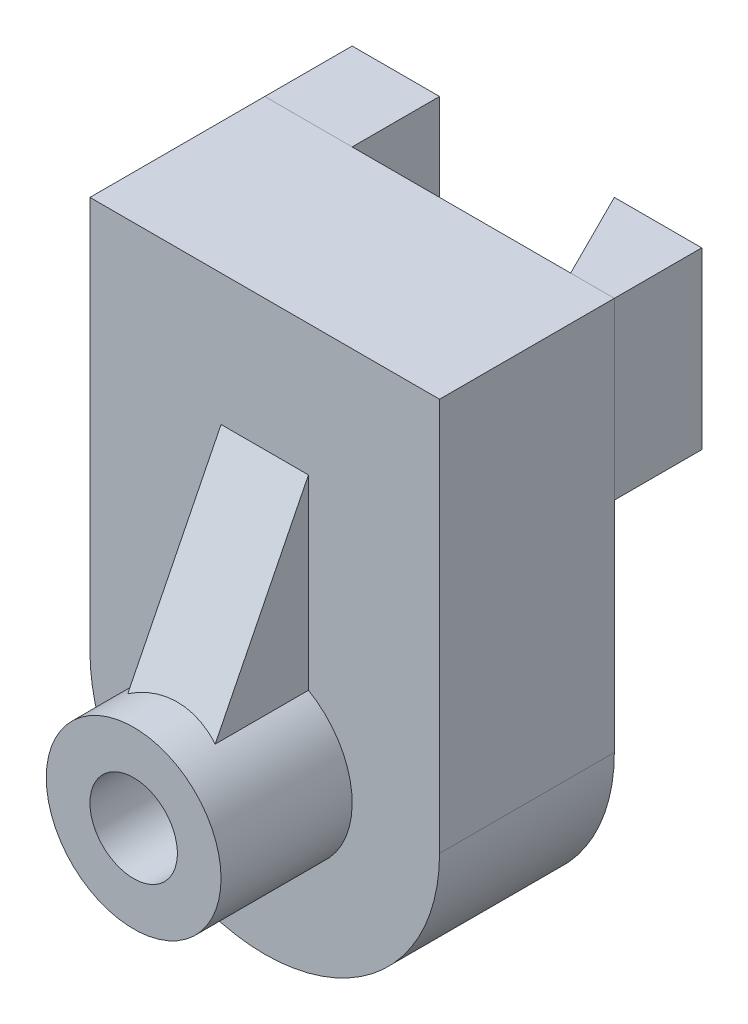
ISO-10303-21;
HEADER;
FILE_DESCRIPTION(('STEP AP214'),'2;1');
FILE_NAME('part.step','',(''),(''),'','','');
FILE_SCHEMA(('AUTOMOTIVE_DESIGN { 1 0 10303 214 1 1 1 1 }'));
ENDSEC;
DATA;
#1=APPLICATION_CONTEXT('core data for automotive mechanical design processes');
#2=APPLICATION_PROTOCOL_DEFINITION('international standard','automotive_design',2000,#1);
#3=PRODUCT_CONTEXT('',#1,'mechanical');
#4=PRODUCT('Part','Part','',(#3));
#5=PRODUCT_RELATED_PRODUCT_CATEGORY('part','',(#4));
#6=PRODUCT_DEFINITION_FORMATION('','',#4);
#7=PRODUCT_DEFINITION_CONTEXT('part definition',#1,'design');
#8=PRODUCT_DEFINITION('design','',#6,#7);
#9=PRODUCT_DEFINITION_SHAPE('','',#8);
#10=(LENGTH_UNIT() NAMED_UNIT(*) SI_UNIT(.MILLI.,.METRE.));
#11=(NAMED_UNIT(*) PLANE_ANGLE_UNIT() SI_UNIT($,.RADIAN.));
#12=(NAMED_UNIT(*) SI_UNIT($,.STERADIAN.) SOLID_ANGLE_UNIT());
#13=UNCERTAINTY_MEASURE_WITH_UNIT(LENGTH_MEASURE(1.E-05),#10,'distance_accuracy_value','');
#14=(GEOMETRIC_REPRESENTATION_CONTEXT(3) GLOBAL_UNCERTAINTY_ASSIGNED_CONTEXT((#13)) GLOBAL_UNIT_ASSIGNED_CONTEXT((#10,
#11,#12)) REPRESENTATION_CONTEXT('',''));
#15=CARTESIAN_POINT('',(0.,0.,0.));
#16=DIRECTION('',(0.,0.,1.));
#17=DIRECTION('',(1.,0.,0.));
#18=AXIS2_PLACEMENT_3D('',#15,#16,#17);
#19=CARTESIAN_POINT('',(-10.,-20.,0.));
#20=DIRECTION('',(-1.,0.,0.));
#21=DIRECTION('',(0.,0.,1.));
#22=AXIS2_PLACEMENT_3D('',#19,#20,#21);
#23=PLANE('',#22);
#24=DIRECTION('',(0.,0.,1.));
#25=VECTOR('',#24,1.);
#26=CARTESIAN_POINT('',(-10.,0.,0.));
#27=LINE('',#26,#25);
#28=CARTESIAN_POINT('',(-10.,0.,-10.));
#29=VERTEX_POINT('',#28);
#30=CARTESIAN_POINT('',(-10.,0.,0.));
#31=VERTEX_POINT('',#30);
#32=EDGE_CURVE('E117',#29,#31,#27,.T.);
#33=ORIENTED_EDGE('',*,*,#32,.T.);
#34=DIRECTION('',(0.,1.,0.));
#35=VECTOR('',#34,1.);
#36=CARTESIAN_POINT('',(-10.,-20.,0.));
#37=LINE('',#36,#35);
#38=CARTESIAN_POINT('',(-10.,-20.,0.));
#39=VERTEX_POINT('',#38);
#40=EDGE_CURVE('E12',#39,#31,#37,.T.);
#41=ORIENTED_EDGE('',*,*,#40,.F.);
#42=DIRECTION('',(0.,0.,1.));
#43=VECTOR('',#42,1.);
#44=CARTESIAN_POINT('',(-10.,-20.,0.));
#45=LINE('',#44,#43);
#46=CARTESIAN_POINT('',(-10.,-20.,-10.));
#47=VERTEX_POINT('',#46);
#48=EDGE_CURVE('E72',#47,#39,#45,.T.);
#49=ORIENTED_EDGE('',*,*,#48,.F.);
#50=DIRECTION('',(0.,1.,0.));
#51=VECTOR('',#50,1.);
#52=CARTESIAN_POINT('',(-10.,-20.,-10.));
#53=LINE('',#52,#51);
#54=EDGE_CURVE('E57',#47,#29,#53,.T.);
#55=ORIENTED_EDGE('',*,*,#54,.T.);
#56=EDGE_LOOP('',(#33,#41,#49,#55));
#57=FACE_BOUND('',#56,.T.);
#58=ADVANCED_FACE('F54',(#57),#23,.F.);
#59=CARTESIAN_POINT('',(0.,-20.,0.));
#60=DIRECTION('',(0.,0.,1.));
#61=DIRECTION('',(1.,0.,0.));
#62=AXIS2_PLACEMENT_3D('',#59,#60,#61);
#63=PLANE('',#62);
#64=DIRECTION('',(1.,0.,0.));
#65=VECTOR('',#64,1.);
#66=CARTESIAN_POINT('',(0.,0.,0.));
#67=LINE('',#66,#65);
#68=CARTESIAN_POINT('',(-20.,0.,0.));
#69=VERTEX_POINT('',#68);
#70=EDGE_CURVE('E113',#69,#31,#67,.T.);
#71=ORIENTED_EDGE('',*,*,#70,.F.);
#72=DIRECTION('',(0.,1.,0.));
#73=VECTOR('',#72,1.);
#74=CARTESIAN_POINT('',(-20.,-20.,0.));
#75=LINE('',#74,#73);
#76=CARTESIAN_POINT('',(-20.,-20.,0.));
#77=VERTEX_POINT('',#76);
#78=EDGE_CURVE('E63',#77,#69,#75,.T.);
#79=ORIENTED_EDGE('',*,*,#78,.F.);
#80=DIRECTION('',(1.,0.,0.));
#81=VECTOR('',#80,1.);
#82=CARTESIAN_POINT('',(0.,-20.,0.));
#83=LINE('',#82,#81);
#84=EDGE_CURVE('E102',#77,#39,#83,.T.);
#85=ORIENTED_EDGE('',*,*,#84,.T.);
#86=ORIENTED_EDGE('',*,*,#40,.T.);
#87=EDGE_LOOP('',(#71,#79,#85,#86));
#88=FACE_BOUND('',#87,.T.);
#89=ADVANCED_FACE('F127',(#88),#63,.T.);
#90=CARTESIAN_POINT('',(-20.,-20.,0.));
#91=DIRECTION('',(1.,0.,0.));
#92=DIRECTION('',(0.,0.,-1.));
#93=AXIS2_PLACEMENT_3D('',#90,#91,#92);
#94=PLANE('',#93);
#95=DIRECTION('',(0.,0.,-1.));
#96=VECTOR('',#95,1.);
#97=CARTESIAN_POINT('',(-20.,0.,0.));
#98=LINE('',#97,#96);
#99=CARTESIAN_POINT('',(-20.,0.,-10.));
#100=VERTEX_POINT('',#99);
#101=EDGE_CURVE('E107',#69,#100,#98,.T.);
#102=ORIENTED_EDGE('',*,*,#101,.T.);
#103=DIRECTION('',(0.,1.,0.));
#104=VECTOR('',#103,1.);
#105=CARTESIAN_POINT('',(-20.,-20.,-10.));
#106=LINE('',#105,#104);
#107=CARTESIAN_POINT('',(-20.,-20.,-10.));
#108=VERTEX_POINT('',#107);
#109=EDGE_CURVE('E105',#108,#100,#106,.T.);
#110=ORIENTED_EDGE('',*,*,#109,.F.);
#111=DIRECTION('',(0.,0.,-1.));
#112=VECTOR('',#111,1.);
#113=CARTESIAN_POINT('',(-20.,-20.,0.));
#114=LINE('',#113,#112);
#115=EDGE_CURVE('E99',#77,#108,#114,.T.);
#116=ORIENTED_EDGE('',*,*,#115,.F.);
#117=ORIENTED_EDGE('',*,*,#78,.T.);
#118=EDGE_LOOP('',(#102,#110,#116,#117));
#119=FACE_BOUND('',#118,.T.);
#120=ADVANCED_FACE('F106',(#119),#94,.F.);
#121=CARTESIAN_POINT('',(0.,-20.,-10.));
#122=DIRECTION('',(0.,0.,1.));
#123=DIRECTION('',(1.,0.,0.));
#124=AXIS2_PLACEMENT_3D('',#121,#122,#123);
#125=PLANE('',#124);
#126=DIRECTION('',(1.,0.,0.));
#127=VECTOR('',#126,1.);
#128=CARTESIAN_POINT('',(0.,0.,-10.));
#129=LINE('',#128,#127);
#130=EDGE_CURVE('E119',#100,#29,#129,.T.);
#131=ORIENTED_EDGE('',*,*,#130,.T.);
#132=ORIENTED_EDGE('',*,*,#54,.F.);
#133=DIRECTION('',(1.,0.,0.));
#134=VECTOR('',#133,1.);
#135=CARTESIAN_POINT('',(0.,-20.,-10.));
#136=LINE('',#135,#134);
#137=EDGE_CURVE('E97',#108,#47,#136,.T.);
#138=ORIENTED_EDGE('',*,*,#137,.F.);
#139=ORIENTED_EDGE('',*,*,#109,.T.);
#140=EDGE_LOOP('',(#131,#132,#138,#139));
#141=FACE_BOUND('',#140,.T.);
#142=ADVANCED_FACE('F110',(#141),#125,.F.);
#143=CARTESIAN_POINT('',(0.,-20.,0.));
#144=DIRECTION('',(0.,1.,0.));
#145=DIRECTION('',(0.,0.,1.));
#146=AXIS2_PLACEMENT_3D('',#143,#144,#145);
#147=PLANE('',#146);
#148=ORIENTED_EDGE('',*,*,#48,.T.);
#149=ORIENTED_EDGE('',*,*,#84,.F.);
#150=ORIENTED_EDGE('',*,*,#115,.T.);
#151=ORIENTED_EDGE('',*,*,#137,.T.);
#152=EDGE_LOOP('',(#148,#149,#150,#151));
#153=FACE_BOUND('',#152,.T.);
#154=ADVANCED_FACE('F101',(#153),#147,.F.);
#155=CARTESIAN_POINT('',(0.,0.,0.));
#156=DIRECTION('',(0.,1.,0.));
#157=DIRECTION('',(0.,0.,1.));
#158=AXIS2_PLACEMENT_3D('',#155,#156,#157);
#159=PLANE('',#158);
#160=ORIENTED_EDGE('',*,*,#32,.F.);
#161=ORIENTED_EDGE('',*,*,#130,.F.);
#162=ORIENTED_EDGE('',*,*,#101,.F.);
#163=ORIENTED_EDGE('',*,*,#70,.T.);
#164=EDGE_LOOP('',(#160,#161,#162,#163));
#165=FACE_BOUND('',#164,.T.);
#166=ADVANCED_FACE('F126',(#165),#159,.T.);
#167=CLOSED_SHELL('',(#58,#89,#120,#142,#154,#166));
#168=MANIFOLD_SOLID_BREP('B2',#167);
#169=CARTESIAN_POINT('',(0.,-20.,-10.));
#170=DIRECTION('',(0.,0.,-1.));
#171=DIRECTION('',(-1.,0.,0.));
#172=AXIS2_PLACEMENT_3D('',#169,#170,#171);
#173=PLANE('',#172);
#174=DIRECTION('',(-1.,0.,0.));
#175=VECTOR('',#174,1.);
#176=CARTESIAN_POINT('',(0.,0.,-10.));
#177=LINE('',#176,#175);
#178=CARTESIAN_POINT('',(20.,0.,-10.));
#179=VERTEX_POINT('',#178);
#180=CARTESIAN_POINT('',(10.,0.,-10.));
#181=VERTEX_POINT('',#180);
#182=EDGE_CURVE('E251',#179,#181,#177,.T.);
#183=ORIENTED_EDGE('',*,*,#182,.F.);
#184=DIRECTION('',(0.,1.,0.));
#185=VECTOR('',#184,1.);
#186=CARTESIAN_POINT('',(20.,-20.,-10.));
#187=LINE('',#186,#185);
#188=CARTESIAN_POINT('',(20.,-20.,-10.));
#189=VERTEX_POINT('',#188);
#190=EDGE_CURVE('E52',#189,#179,#187,.T.);
#191=ORIENTED_EDGE('',*,*,#190,.F.);
#192=DIRECTION('',(-1.,0.,0.));
#193=VECTOR('',#192,1.);
#194=CARTESIAN_POINT('',(0.,-20.,-10.));
#195=LINE('',#194,#193);
#196=CARTESIAN_POINT('',(10.,-20.,-10.));
#197=VERTEX_POINT('',#196);
#198=EDGE_CURVE('E245',#189,#197,#195,.T.);
#199=ORIENTED_EDGE('',*,*,#198,.T.);
#200=DIRECTION('',(0.,1.,0.));
#201=VECTOR('',#200,1.);
#202=CARTESIAN_POINT('',(10.,-20.,-10.));
#203=LINE('',#202,#201);
#204=EDGE_CURVE('E190',#197,#181,#203,.T.);
#205=ORIENTED_EDGE('',*,*,#204,.T.);
#206=EDGE_LOOP('',(#183,#191,#199,#205));
#207=FACE_BOUND('',#206,.T.);
#208=ADVANCED_FACE('F187',(#207),#173,.T.);
#209=CARTESIAN_POINT('',(20.,-20.,0.));
#210=DIRECTION('',(1.,0.,0.));
#211=DIRECTION('',(0.,0.,-1.));
#212=AXIS2_PLACEMENT_3D('',#209,#210,#211);
#213=PLANE('',#212);
#214=DIRECTION('',(0.,0.,-1.));
#215=VECTOR('',#214,1.);
#216=CARTESIAN_POINT('',(20.,0.,0.));
#217=LINE('',#216,#215);
#218=CARTESIAN_POINT('',(20.,0.,0.));
#219=VERTEX_POINT('',#218);
#220=EDGE_CURVE('E247',#219,#179,#217,.T.);
#221=ORIENTED_EDGE('',*,*,#220,.F.);
#222=DIRECTION('',(0.,1.,0.));
#223=VECTOR('',#222,1.);
#224=CARTESIAN_POINT('',(20.,-20.,0.));
#225=LINE('',#224,#223);
#226=CARTESIAN_POINT('',(20.,-20.,0.));
#227=VERTEX_POINT('',#226);
#228=EDGE_CURVE('E196',#227,#219,#225,.T.);
#229=ORIENTED_EDGE('',*,*,#228,.F.);
#230=DIRECTION('',(0.,0.,-1.));
#231=VECTOR('',#230,1.);
#232=CARTESIAN_POINT('',(20.,-20.,0.));
#233=LINE('',#232,#231);
#234=EDGE_CURVE('E242',#227,#189,#233,.T.);
#235=ORIENTED_EDGE('',*,*,#234,.T.);
#236=ORIENTED_EDGE('',*,*,#190,.T.);
#237=EDGE_LOOP('',(#221,#229,#235,#236));
#238=FACE_BOUND('',#237,.T.);
#239=ADVANCED_FACE('F261',(#238),#213,.T.);
#240=CARTESIAN_POINT('',(0.,-20.,0.));
#241=DIRECTION('',(0.,0.,1.));
#242=DIRECTION('',(1.,0.,0.));
#243=AXIS2_PLACEMENT_3D('',#240,#241,#242);
#244=PLANE('',#243);
#245=DIRECTION('',(1.,0.,0.));
#246=VECTOR('',#245,1.);
#247=CARTESIAN_POINT('',(0.,0.,0.));
#248=LINE('',#247,#246);
#249=CARTESIAN_POINT('',(15.,0.,0.));
#250=VERTEX_POINT('',#249);
#251=EDGE_CURVE('E237',#250,#219,#248,.T.);
#252=ORIENTED_EDGE('',*,*,#251,.F.);
#253=DIRECTION('',(0.,1.,0.));
#254=VECTOR('',#253,1.);
#255=CARTESIAN_POINT('',(15.,-20.,0.));
#256=LINE('',#255,#254);
#257=CARTESIAN_POINT('',(15.,-20.,0.));
#258=VERTEX_POINT('',#257);
#259=EDGE_CURVE('E232',#258,#250,#256,.T.);
#260=ORIENTED_EDGE('',*,*,#259,.F.);
#261=DIRECTION('',(1.,0.,0.));
#262=VECTOR('',#261,1.);
#263=CARTESIAN_POINT('',(0.,-20.,0.));
#264=LINE('',#263,#262);
#265=EDGE_CURVE('E235',#258,#227,#264,.T.);
#266=ORIENTED_EDGE('',*,*,#265,.T.);
#267=ORIENTED_EDGE('',*,*,#228,.T.);
#268=EDGE_LOOP('',(#252,#260,#266,#267));
#269=FACE_BOUND('',#268,.T.);
#270=ADVANCED_FACE('F234',(#269),#244,.T.);
#271=CARTESIAN_POINT('',(12.,-20.,-6.));
#272=DIRECTION('',(-0.894427190999916,0.,0.447213595499958));
#273=DIRECTION('',(0.447213595499958,0.,0.894427190999916));
#274=AXIS2_PLACEMENT_3D('',#271,#272,#273);
#275=PLANE('',#274);
#276=DIRECTION('',(0.447213595499958,0.,0.894427190999916));
#277=VECTOR('',#276,1.);
#278=CARTESIAN_POINT('',(12.,0.,-6.));
#279=LINE('',#278,#277);
#280=EDGE_CURVE('E254',#181,#250,#279,.T.);
#281=ORIENTED_EDGE('',*,*,#280,.F.);
#282=ORIENTED_EDGE('',*,*,#204,.F.);
#283=DIRECTION('',(0.447213595499958,0.,0.894427190999916));
#284=VECTOR('',#283,1.);
#285=CARTESIAN_POINT('',(12.,-20.,-6.));
#286=LINE('',#285,#284);
#287=EDGE_CURVE('E241',#197,#258,#286,.T.);
#288=ORIENTED_EDGE('',*,*,#287,.T.);
#289=ORIENTED_EDGE('',*,*,#259,.T.);
#290=EDGE_LOOP('',(#281,#282,#288,#289));
#291=FACE_BOUND('',#290,.T.);
#292=ADVANCED_FACE('F244',(#291),#275,.T.);
#293=CARTESIAN_POINT('',(0.,-20.,0.));
#294=DIRECTION('',(0.,1.,0.));
#295=DIRECTION('',(0.,0.,1.));
#296=AXIS2_PLACEMENT_3D('',#293,#294,#295);
#297=PLANE('',#296);
#298=ORIENTED_EDGE('',*,*,#198,.F.);
#299=ORIENTED_EDGE('',*,*,#234,.F.);
#300=ORIENTED_EDGE('',*,*,#265,.F.);
#301=ORIENTED_EDGE('',*,*,#287,.F.);
#302=EDGE_LOOP('',(#298,#299,#300,#301));
#303=FACE_BOUND('',#302,.T.);
#304=ADVANCED_FACE('F240',(#303),#297,.F.);
#305=CARTESIAN_POINT('',(0.,0.,0.));
#306=DIRECTION('',(0.,1.,0.));
#307=DIRECTION('',(0.,0.,1.));
#308=AXIS2_PLACEMENT_3D('',#305,#306,#307);
#309=PLANE('',#308);
#310=ORIENTED_EDGE('',*,*,#182,.T.);
#311=ORIENTED_EDGE('',*,*,#280,.T.);
#312=ORIENTED_EDGE('',*,*,#251,.T.);
#313=ORIENTED_EDGE('',*,*,#220,.T.);
#314=EDGE_LOOP('',(#310,#311,#312,#313));
#315=FACE_BOUND('',#314,.T.);
#316=ADVANCED_FACE('F260',(#315),#309,.T.);
#317=CLOSED_SHELL('',(#208,#239,#270,#292,#304,#316));
#318=MANIFOLD_SOLID_BREP('B6',#317);
#319=CARTESIAN_POINT('',(0.,-65.,20.));
#320=DIRECTION('',(0.,0.,-1.));
#321=DIRECTION('',(-1.,0.,0.));
#322=AXIS2_PLACEMENT_3D('',#319,#320,#321);
#323=PLANE('',#322);
#324=CARTESIAN_POINT('',(0.,-45.,20.));
#325=DIRECTION('',(0.,0.,-1.));
#326=DIRECTION('',(-1.,0.,0.));
#327=AXIS2_PLACEMENT_3D('',#324,#325,#326);
#328=CIRCLE('',#327,20.);
#329=CARTESIAN_POINT('',(0.,-65.,20.));
#330=VERTEX_POINT('',#329);
#331=CARTESIAN_POINT('',(20.,-45.,20.));
#332=VERTEX_POINT('',#331);
#333=EDGE_CURVE('E436',#330,#332,#328,.F.);
#334=ORIENTED_EDGE('',*,*,#333,.T.);
#335=DIRECTION('',(0.,1.,0.));
#336=VECTOR('',#335,1.);
#337=CARTESIAN_POINT('',(20.,-65.,20.));
#338=LINE('',#337,#336);
#339=CARTESIAN_POINT('',(20.,0.,20.));
#340=VERTEX_POINT('',#339);
#341=EDGE_CURVE('E420',#332,#340,#338,.T.);
#342=ORIENTED_EDGE('',*,*,#341,.T.);
#343=DIRECTION('',(-1.,0.,0.));
#344=VECTOR('',#343,1.);
#345=CARTESIAN_POINT('',(0.,0.,20.));
#346=LINE('',#345,#344);
#347=CARTESIAN_POINT('',(-20.,0.,20.));
#348=VERTEX_POINT('',#347);
#349=EDGE_CURVE('E409',#340,#348,#346,.T.);
#350=ORIENTED_EDGE('',*,*,#349,.T.);
#351=DIRECTION('',(0.,1.,0.));
#352=VECTOR('',#351,1.);
#353=CARTESIAN_POINT('',(-20.,-65.,20.));
#354=LINE('',#353,#352);
#355=CARTESIAN_POINT('',(-20.,-45.,20.));
#356=VERTEX_POINT('',#355);
#357=EDGE_CURVE('E421',#356,#348,#354,.T.);
#358=ORIENTED_EDGE('',*,*,#357,.F.);
#359=CARTESIAN_POINT('',(0.,-45.,20.));
#360=DIRECTION('',(0.,0.,-1.));
#361=DIRECTION('',(-1.,0.,0.));
#362=AXIS2_PLACEMENT_3D('',#359,#360,#361);
#363=CIRCLE('',#362,20.);
#364=EDGE_CURVE('E438',#356,#330,#363,.F.);
#365=ORIENTED_EDGE('',*,*,#364,.T.);
#366=EDGE_LOOP('',(#334,#342,#350,#358,#365));
#367=FACE_BOUND('',#366,.T.);
#368=DIRECTION('',(0.,-1.,0.));
#369=VECTOR('',#368,1.);
#370=CARTESIAN_POINT('',(5.,-65.,20.));
#371=LINE('',#370,#369);
#372=CARTESIAN_POINT('',(5.,-15.,20.));
#373=VERTEX_POINT('',#372);
#374=CARTESIAN_POINT('',(5.,-36.3397459621556,20.));
#375=VERTEX_POINT('',#374);
#376=EDGE_CURVE('E385',#373,#375,#371,.T.);
#377=ORIENTED_EDGE('',*,*,#376,.T.);
#378=CARTESIAN_POINT('',(0.,-45.,20.));
#379=DIRECTION('',(0.,0.,-1.));
#380=DIRECTION('',(-1.,0.,0.));
#381=AXIS2_PLACEMENT_3D('',#378,#379,#380);
#382=CIRCLE('',#381,10.);
#383=CARTESIAN_POINT('',(-5.,-36.3397459621556,20.));
#384=VERTEX_POINT('',#383);
#385=EDGE_CURVE('E185',#384,#375,#382,.F.);
#386=ORIENTED_EDGE('',*,*,#385,.F.);
#387=DIRECTION('',(0.,-1.,0.));
#388=VECTOR('',#387,1.);
#389=CARTESIAN_POINT('',(-5.,-65.,20.));
#390=LINE('',#389,#388);
#391=CARTESIAN_POINT('',(-5.,-15.,20.));
#392=VERTEX_POINT('',#391);
#393=EDGE_CURVE('E331',#392,#384,#390,.T.);
#394=ORIENTED_EDGE('',*,*,#393,.F.);
#395=DIRECTION('',(-1.,0.,0.));
#396=VECTOR('',#395,1.);
#397=CARTESIAN_POINT('',(0.,-15.,20.));
#398=LINE('',#397,#396);
#399=EDGE_CURVE('E326',#392,#373,#398,.F.);
#400=ORIENTED_EDGE('',*,*,#399,.T.);
#401=EDGE_LOOP('',(#377,#386,#394,#400));
#402=FACE_BOUND('',#401,.T.);
#403=ADVANCED_FACE('F311',(#367,#402),#323,.F.);
#404=CARTESIAN_POINT('',(-20.,-65.,0.));
#405=DIRECTION('',(1.,0.,0.));
#406=DIRECTION('',(0.,0.,-1.));
#407=AXIS2_PLACEMENT_3D('',#404,#405,#406);
#408=PLANE('',#407);
#409=DIRECTION('',(0.,1.,0.));
#410=VECTOR('',#409,1.);
#411=CARTESIAN_POINT('',(-20.,-65.,0.));
#412=LINE('',#411,#410);
#413=CARTESIAN_POINT('',(-20.,-45.,0.));
#414=VERTEX_POINT('',#413);
#415=CARTESIAN_POINT('',(-20.,0.,0.));
#416=VERTEX_POINT('',#415);
#417=EDGE_CURVE('E424',#414,#416,#412,.T.);
#418=ORIENTED_EDGE('',*,*,#417,.F.);
#419=DIRECTION('',(0.,0.,-1.));
#420=VECTOR('',#419,1.);
#421=CARTESIAN_POINT('',(-20.,-45.,0.));
#422=LINE('',#421,#420);
#423=EDGE_CURVE('E433',#414,#356,#422,.F.);
#424=ORIENTED_EDGE('',*,*,#423,.T.);
#425=ORIENTED_EDGE('',*,*,#357,.T.);
#426=DIRECTION('',(0.,0.,-1.));
#427=VECTOR('',#426,1.);
#428=CARTESIAN_POINT('',(-20.,0.,0.));
#429=LINE('',#428,#427);
#430=EDGE_CURVE('E417',#348,#416,#429,.T.);
#431=ORIENTED_EDGE('',*,*,#430,.T.);
#432=EDGE_LOOP('',(#418,#424,#425,#431));
#433=FACE_BOUND('',#432,.T.);
#434=ADVANCED_FACE('F464',(#433),#408,.F.);
#435=CARTESIAN_POINT('',(0.,-65.,0.));
#436=DIRECTION('',(0.,0.,1.));
#437=DIRECTION('',(1.,0.,0.));
#438=AXIS2_PLACEMENT_3D('',#435,#436,#437);
#439=PLANE('',#438);
#440=CARTESIAN_POINT('',(0.,-45.,0.));
#441=DIRECTION('',(0.,0.,-1.));
#442=DIRECTION('',(-1.,0.,0.));
#443=AXIS2_PLACEMENT_3D('',#440,#441,#442);
#444=CIRCLE('',#443,10.);
#445=CARTESIAN_POINT('',(-10.,-45.,0.));
#446=VERTEX_POINT('',#445);
#447=EDGE_CURVE('E519',#446,#446,#444,.T.);
#448=ORIENTED_EDGE('',*,*,#447,.F.);
#449=EDGE_LOOP('',(#448));
#450=FACE_BOUND('',#449,.T.);
#451=CARTESIAN_POINT('',(0.,-45.,0.));
#452=DIRECTION('',(0.,0.,1.));
#453=DIRECTION('',(1.,0.,0.));
#454=AXIS2_PLACEMENT_3D('',#451,#452,#453);
#455=CIRCLE('',#454,20.);
#456=CARTESIAN_POINT('',(20.,-45.,0.));
#457=VERTEX_POINT('',#456);
#458=CARTESIAN_POINT('',(0.,-65.,0.));
#459=VERTEX_POINT('',#458);
#460=EDGE_CURVE('E423',#457,#459,#455,.F.);
#461=ORIENTED_EDGE('',*,*,#460,.T.);
#462=CARTESIAN_POINT('',(0.,-45.,0.));
#463=DIRECTION('',(0.,0.,1.));
#464=DIRECTION('',(1.,0.,0.));
#465=AXIS2_PLACEMENT_3D('',#462,#463,#464);
#466=CIRCLE('',#465,20.);
#467=EDGE_CURVE('E431',#459,#414,#466,.F.);
#468=ORIENTED_EDGE('',*,*,#467,.T.);
#469=ORIENTED_EDGE('',*,*,#417,.T.);
#470=DIRECTION('',(1.,0.,0.));
#471=VECTOR('',#470,1.);
#472=CARTESIAN_POINT('',(0.,0.,0.));
#473=LINE('',#472,#471);
#474=CARTESIAN_POINT('',(20.,0.,0.));
#475=VERTEX_POINT('',#474);
#476=EDGE_CURVE('E415',#416,#475,#473,.T.);
#477=ORIENTED_EDGE('',*,*,#476,.T.);
#478=DIRECTION('',(0.,1.,0.));
#479=VECTOR('',#478,1.);
#480=CARTESIAN_POINT('',(20.,-65.,0.));
#481=LINE('',#480,#479);
#482=EDGE_CURVE('E426',#457,#475,#481,.T.);
#483=ORIENTED_EDGE('',*,*,#482,.F.);
#484=EDGE_LOOP('',(#461,#468,#469,#477,#483));
#485=FACE_BOUND('',#484,.T.);
#486=ADVANCED_FACE('F466',(#450,#485),#439,.F.);
#487=CARTESIAN_POINT('',(20.,-65.,0.));
#488=DIRECTION('',(-1.,0.,0.));
#489=DIRECTION('',(0.,0.,1.));
#490=AXIS2_PLACEMENT_3D('',#487,#488,#489);
#491=PLANE('',#490);
#492=ORIENTED_EDGE('',*,*,#341,.F.);
#493=DIRECTION('',(0.,0.,1.));
#494=VECTOR('',#493,1.);
#495=CARTESIAN_POINT('',(20.,-45.,0.));
#496=LINE('',#495,#494);
#497=EDGE_CURVE('E319',#332,#457,#496,.F.);
#498=ORIENTED_EDGE('',*,*,#497,.T.);
#499=ORIENTED_EDGE('',*,*,#482,.T.);
#500=DIRECTION('',(0.,0.,1.));
#501=VECTOR('',#500,1.);
#502=CARTESIAN_POINT('',(20.,0.,0.));
#503=LINE('',#502,#501);
#504=EDGE_CURVE('E412',#475,#340,#503,.T.);
#505=ORIENTED_EDGE('',*,*,#504,.T.);
#506=EDGE_LOOP('',(#492,#498,#499,#505));
#507=FACE_BOUND('',#506,.T.);
#508=ADVANCED_FACE('F454',(#507),#491,.F.);
#509=CARTESIAN_POINT('',(0.,0.,0.));
#510=DIRECTION('',(0.,1.,0.));
#511=DIRECTION('',(0.,0.,1.));
#512=AXIS2_PLACEMENT_3D('',#509,#510,#511);
#513=PLANE('',#512);
#514=ORIENTED_EDGE('',*,*,#504,.F.);
#515=ORIENTED_EDGE('',*,*,#476,.F.);
#516=ORIENTED_EDGE('',*,*,#430,.F.);
#517=ORIENTED_EDGE('',*,*,#349,.F.);
#518=EDGE_LOOP('',(#514,#515,#516,#517));
#519=FACE_BOUND('',#518,.T.);
#520=ADVANCED_FACE('F461',(#519),#513,.T.);
#521=CARTESIAN_POINT('',(0.,-45.,0.));
#522=DIRECTION('',(0.,0.,1.));
#523=DIRECTION('',(1.,0.,0.));
#524=AXIS2_PLACEMENT_3D('',#521,#522,#523);
#525=CYLINDRICAL_SURFACE('',#524,20.);
#526=ORIENTED_EDGE('',*,*,#497,.F.);
#527=ORIENTED_EDGE('',*,*,#333,.F.);
#528=DIRECTION('',(0.,0.,1.));
#529=VECTOR('',#528,1.);
#530=CARTESIAN_POINT('',(0.,-65.,0.));
#531=LINE('',#530,#529);
#532=EDGE_CURVE('E408',#459,#330,#531,.T.);
#533=ORIENTED_EDGE('',*,*,#532,.F.);
#534=ORIENTED_EDGE('',*,*,#460,.F.);
#535=EDGE_LOOP('',(#526,#527,#533,#534));
#536=FACE_BOUND('',#535,.T.);
#537=ADVANCED_FACE('F313',(#536),#525,.T.);
#538=CARTESIAN_POINT('',(0.,-45.,0.));
#539=DIRECTION('',(0.,0.,-1.));
#540=DIRECTION('',(-1.,0.,0.));
#541=AXIS2_PLACEMENT_3D('',#538,#539,#540);
#542=CYLINDRICAL_SURFACE('',#541,20.);
#543=ORIENTED_EDGE('',*,*,#532,.T.);
#544=ORIENTED_EDGE('',*,*,#364,.F.);
#545=ORIENTED_EDGE('',*,*,#423,.F.);
#546=ORIENTED_EDGE('',*,*,#467,.F.);
#547=EDGE_LOOP('',(#543,#544,#545,#546));
#548=FACE_BOUND('',#547,.T.);
#549=ADVANCED_FACE('F444',(#548),#542,.T.);
#550=CARTESIAN_POINT('',(0.,-45.,35.));
#551=DIRECTION('',(0.,0.,-1.));
#552=DIRECTION('',(-1.,0.,0.));
#553=AXIS2_PLACEMENT_3D('',#550,#551,#552);
#554=CYLINDRICAL_SURFACE('',#553,10.);
#555=ORIENTED_EDGE('',*,*,#385,.T.);
#556=DIRECTION('',(0.,0.,-1.));
#557=VECTOR('',#556,1.);
#558=CARTESIAN_POINT('',(5.,-36.3397459621556,35.));
#559=LINE('',#558,#557);
#560=CARTESIAN_POINT('',(5.,-36.3397459621556,30.6698729810778));
#561=VERTEX_POINT('',#560);
#562=EDGE_CURVE('E380',#375,#561,#559,.F.);
#563=ORIENTED_EDGE('',*,*,#562,.T.);
#564=CARTESIAN_POINT('',(0.,-45.,35.));
#565=DIRECTION('',(0.,-0.447213595499958,-0.894427190999916));
#566=DIRECTION('',(0.,0.894427190999916,-0.447213595499958));
#567=AXIS2_PLACEMENT_3D('',#564,#565,#566);
#568=ELLIPSE('',#567,11.180339887499,10.);
#569=CARTESIAN_POINT('',(-5.,-36.3397459621556,30.6698729810778));
#570=VERTEX_POINT('',#569);
#571=EDGE_CURVE('E374',#561,#570,#568,.F.);
#572=ORIENTED_EDGE('',*,*,#571,.T.);
#573=DIRECTION('',(0.,0.,-1.));
#574=VECTOR('',#573,1.);
#575=CARTESIAN_POINT('',(-5.,-36.3397459621556,35.));
#576=LINE('',#575,#574);
#577=EDGE_CURVE('E378',#384,#570,#576,.F.);
#578=ORIENTED_EDGE('',*,*,#577,.F.);
#579=EDGE_LOOP('',(#555,#563,#572,#578));
#580=FACE_BOUND('',#579,.T.);
#581=CARTESIAN_POINT('',(0.,-45.,35.));
#582=DIRECTION('',(0.,0.,1.));
#583=DIRECTION('',(1.,0.,0.));
#584=AXIS2_PLACEMENT_3D('',#581,#582,#583);
#585=CIRCLE('',#584,10.);
#586=CARTESIAN_POINT('',(10.,-45.,35.));
#587=VERTEX_POINT('',#586);
#588=EDGE_CURVE('E405',#587,#587,#585,.T.);
#589=ORIENTED_EDGE('',*,*,#588,.F.);
#590=EDGE_LOOP('',(#589));
#591=FACE_BOUND('',#590,.T.);
#592=ADVANCED_FACE('F376',(#580,#591),#554,.T.);
#593=CARTESIAN_POINT('',(0.,-45.,35.));
#594=DIRECTION('',(0.,0.,1.));
#595=DIRECTION('',(1.,0.,0.));
#596=AXIS2_PLACEMENT_3D('',#593,#594,#595);
#597=PLANE('',#596);
#598=CARTESIAN_POINT('',(0.,-45.,35.));
#599=DIRECTION('',(0.,0.,-1.));
#600=DIRECTION('',(-1.,0.,0.));
#601=AXIS2_PLACEMENT_3D('',#598,#599,#600);
#602=CIRCLE('',#601,4.99999999999998);
#603=CARTESIAN_POINT('',(-4.99999999999998,-45.,35.));
#604=VERTEX_POINT('',#603);
#605=EDGE_CURVE('E394',#604,#604,#602,.T.);
#606=ORIENTED_EDGE('',*,*,#605,.T.);
#607=EDGE_LOOP('',(#606));
#608=FACE_BOUND('',#607,.T.);
#609=ORIENTED_EDGE('',*,*,#588,.T.);
#610=EDGE_LOOP('',(#609));
#611=FACE_BOUND('',#610,.T.);
#612=ADVANCED_FACE('F489',(#608,#611),#597,.T.);
#613=CARTESIAN_POINT('',(0.,-35.,30.));
#614=DIRECTION('',(0.,-0.447213595499958,-0.894427190999916));
#615=DIRECTION('',(0.,0.894427190999916,-0.447213595499958));
#616=AXIS2_PLACEMENT_3D('',#613,#614,#615);
#617=PLANE('',#616);
#618=ORIENTED_EDGE('',*,*,#399,.F.);
#619=DIRECTION('',(0.,0.894427190999916,-0.447213595499958));
#620=VECTOR('',#619,1.);
#621=CARTESIAN_POINT('',(-5.,-35.,30.));
#622=LINE('',#621,#620);
#623=EDGE_CURVE('E390',#570,#392,#622,.T.);
#624=ORIENTED_EDGE('',*,*,#623,.F.);
#625=ORIENTED_EDGE('',*,*,#571,.F.);
#626=DIRECTION('',(0.,0.894427190999916,-0.447213595499958));
#627=VECTOR('',#626,1.);
#628=CARTESIAN_POINT('',(5.,-35.,30.));
#629=LINE('',#628,#627);
#630=EDGE_CURVE('E391',#561,#373,#629,.T.);
#631=ORIENTED_EDGE('',*,*,#630,.T.);
#632=EDGE_LOOP('',(#618,#624,#625,#631));
#633=FACE_BOUND('',#632,.T.);
#634=ADVANCED_FACE('F393',(#633),#617,.F.);
#635=CARTESIAN_POINT('',(5.,-32.5,17.5));
#636=DIRECTION('',(1.,0.,0.));
#637=DIRECTION('',(0.,0.,-1.));
#638=AXIS2_PLACEMENT_3D('',#635,#636,#637);
#639=PLANE('',#638);
#640=ORIENTED_EDGE('',*,*,#376,.F.);
#641=ORIENTED_EDGE('',*,*,#630,.F.);
#642=ORIENTED_EDGE('',*,*,#562,.F.);
#643=EDGE_LOOP('',(#640,#641,#642));
#644=FACE_BOUND('',#643,.T.);
#645=ADVANCED_FACE('F501',(#644),#639,.T.);
#646=CARTESIAN_POINT('',(-5.,-32.5,17.5));
#647=DIRECTION('',(1.,0.,0.));
#648=DIRECTION('',(0.,0.,-1.));
#649=AXIS2_PLACEMENT_3D('',#646,#647,#648);
#650=PLANE('',#649);
#651=ORIENTED_EDGE('',*,*,#623,.T.);
#652=ORIENTED_EDGE('',*,*,#393,.T.);
#653=ORIENTED_EDGE('',*,*,#577,.T.);
#654=EDGE_LOOP('',(#651,#652,#653));
#655=FACE_BOUND('',#654,.T.);
#656=ADVANCED_FACE('F389',(#655),#650,.F.);
#657=CARTESIAN_POINT('',(0.,-45.,0.));
#658=DIRECTION('',(0.,0.,-1.));
#659=DIRECTION('',(-1.,0.,0.));
#660=AXIS2_PLACEMENT_3D('',#657,#658,#659);
#661=CYLINDRICAL_SURFACE('',#660,4.99999999999999);
#662=ORIENTED_EDGE('',*,*,#605,.F.);
#663=EDGE_LOOP('',(#662));
#664=FACE_BOUND('',#663,.T.);
#665=CARTESIAN_POINT('',(0.,-45.,5.));
#666=DIRECTION('',(0.,0.,-1.));
#667=DIRECTION('',(-1.,0.,0.));
#668=AXIS2_PLACEMENT_3D('',#665,#666,#667);
#669=CIRCLE('',#668,4.99999999999999);
#670=CARTESIAN_POINT('',(-4.99999999999999,-45.,5.));
#671=VERTEX_POINT('',#670);
#672=EDGE_CURVE('E398',#671,#671,#669,.T.);
#673=ORIENTED_EDGE('',*,*,#672,.T.);
#674=EDGE_LOOP('',(#673));
#675=FACE_BOUND('',#674,.T.);
#676=ADVANCED_FACE('F503',(#664,#675),#661,.F.);
#677=CARTESIAN_POINT('',(0.,-45.,0.));
#678=DIRECTION('',(0.,0.,-1.));
#679=DIRECTION('',(-1.,0.,0.));
#680=AXIS2_PLACEMENT_3D('',#677,#678,#679);
#681=CONICAL_SURFACE('',#680,10.,0.785398163397449);
#682=ORIENTED_EDGE('',*,*,#672,.F.);
#683=EDGE_LOOP('',(#682));
#684=FACE_BOUND('',#683,.T.);
#685=ORIENTED_EDGE('',*,*,#447,.T.);
#686=EDGE_LOOP('',(#685));
#687=FACE_BOUND('',#686,.T.);
#688=ADVANCED_FACE('F509',(#684,#687),#681,.F.);
#689=CLOSED_SHELL('',(#403,#434,#486,#508,#520,#537,#549,#592,#612,#634,#645,#656,#676,#688));
#690=MANIFOLD_SOLID_BREP('B46',#689);
#691=ADVANCED_BREP_SHAPE_REPRESENTATION('',(#18,#168,#318,#690),#14);
#692=SHAPE_DEFINITION_REPRESENTATION(#9,#691);
ENDSEC;
END-ISO-10303-21;
